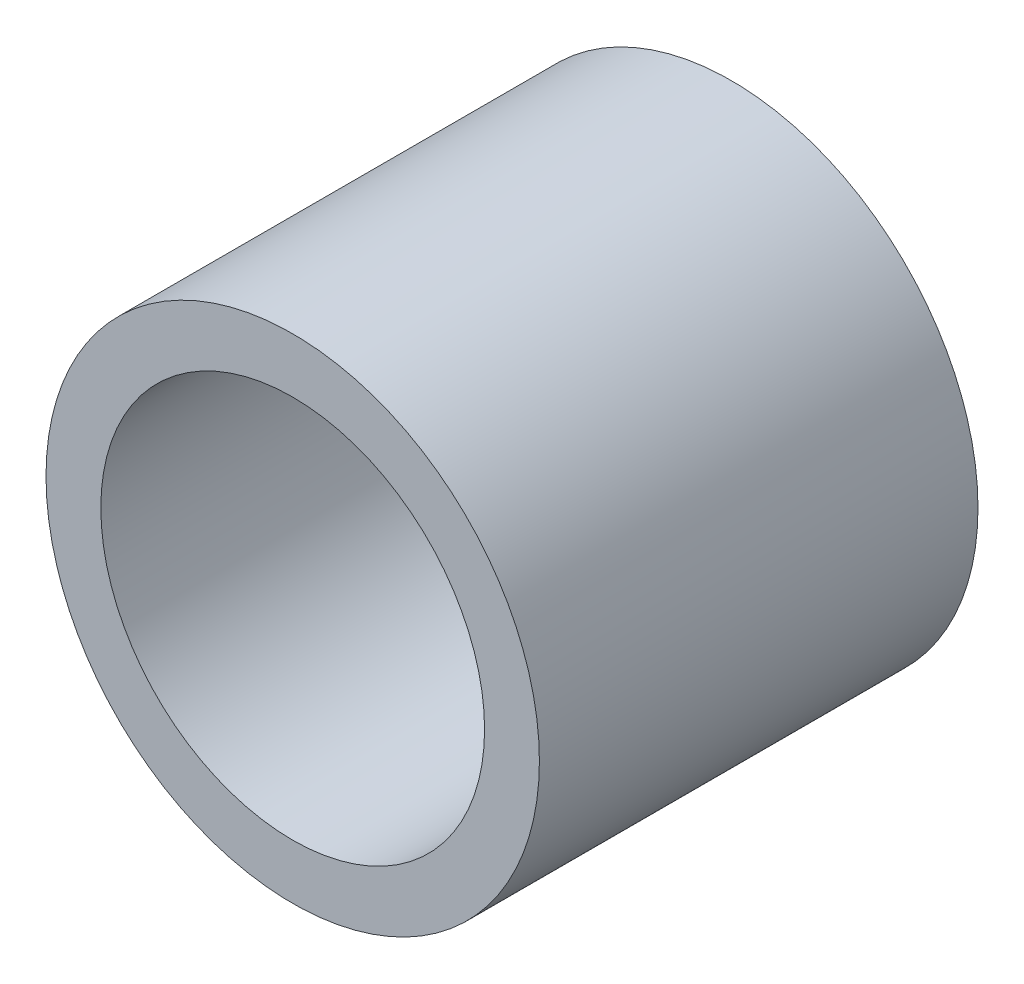
ISO-10303-21;
HEADER;
FILE_DESCRIPTION(('STEP AP214'),'2;1');
FILE_NAME('part.step','',(''),(''),'','','');
FILE_SCHEMA(('AUTOMOTIVE_DESIGN { 1 0 10303 214 1 1 1 1 }'));
ENDSEC;
DATA;
#1=APPLICATION_CONTEXT('core data for automotive mechanical design processes');
#2=APPLICATION_PROTOCOL_DEFINITION('international standard','automotive_design',2000,#1);
#3=PRODUCT_CONTEXT('',#1,'mechanical');
#4=PRODUCT('Part','Part','',(#3));
#5=PRODUCT_RELATED_PRODUCT_CATEGORY('part','',(#4));
#6=PRODUCT_DEFINITION_FORMATION('','',#4);
#7=PRODUCT_DEFINITION_CONTEXT('part definition',#1,'design');
#8=PRODUCT_DEFINITION('design','',#6,#7);
#9=PRODUCT_DEFINITION_SHAPE('','',#8);
#10=(LENGTH_UNIT() NAMED_UNIT(*) SI_UNIT(.MILLI.,.METRE.));
#11=(NAMED_UNIT(*) PLANE_ANGLE_UNIT() SI_UNIT($,.RADIAN.));
#12=(NAMED_UNIT(*) SI_UNIT($,.STERADIAN.) SOLID_ANGLE_UNIT());
#13=UNCERTAINTY_MEASURE_WITH_UNIT(LENGTH_MEASURE(1.E-05),#10,'distance_accuracy_value','');
#14=(GEOMETRIC_REPRESENTATION_CONTEXT(3) GLOBAL_UNCERTAINTY_ASSIGNED_CONTEXT((#13)) GLOBAL_UNIT_ASSIGNED_CONTEXT((#10,
#11,#12)) REPRESENTATION_CONTEXT('',''));
#15=CARTESIAN_POINT('',(0.,0.,0.));
#16=DIRECTION('',(0.,0.,1.));
#17=DIRECTION('',(1.,0.,0.));
#18=AXIS2_PLACEMENT_3D('',#15,#16,#17);
#19=CARTESIAN_POINT('',(0.,0.,50.8));
#20=DIRECTION('',(0.,0.,0.999999999999998));
#21=DIRECTION('',(1.00000000000001,0.,0.));
#22=AXIS2_PLACEMENT_3D('',#19,#20,#21);
#23=PLANE('',#22);
#24=CARTESIAN_POINT('',(0.,0.,50.8));
#25=DIRECTION('',(0.,0.,0.999999999999998));
#26=DIRECTION('',(1.00000000000001,0.,0.));
#27=AXIS2_PLACEMENT_3D('',#24,#25,#26);
#28=CIRCLE('',#27,28.575);
#29=CARTESIAN_POINT('',(-28.5750000000003,0.,50.8));
#30=VERTEX_POINT('',#29);
#31=EDGE_CURVE('E12',#30,#30,#28,.T.);
#32=ORIENTED_EDGE('',*,*,#31,.T.);
#33=EDGE_LOOP('',(#32));
#34=FACE_BOUND('',#33,.T.);
#35=CARTESIAN_POINT('',(0.,0.,50.8));
#36=DIRECTION('',(0.,0.,0.999999999999998));
#37=DIRECTION('',(1.00000000000001,0.,0.));
#38=AXIS2_PLACEMENT_3D('',#35,#36,#37);
#39=CIRCLE('',#38,22.225);
#40=CARTESIAN_POINT('',(-22.2250000000002,0.,50.8));
#41=VERTEX_POINT('',#40);
#42=EDGE_CURVE('E53',#41,#41,#39,.T.);
#43=ORIENTED_EDGE('',*,*,#42,.F.);
#44=EDGE_LOOP('',(#43));
#45=FACE_BOUND('',#44,.T.);
#46=ADVANCED_FACE('F42',(#34,#45),#23,.T.);
#47=CARTESIAN_POINT('',(0.,0.,0.));
#48=DIRECTION('',(0.,0.,0.999999999999998));
#49=DIRECTION('',(1.00000000000001,0.,0.));
#50=AXIS2_PLACEMENT_3D('',#47,#48,#49);
#51=PLANE('',#50);
#52=CARTESIAN_POINT('',(0.,0.,0.));
#53=DIRECTION('',(0.,0.,0.999999999999998));
#54=DIRECTION('',(1.00000000000001,0.,0.));
#55=AXIS2_PLACEMENT_3D('',#52,#53,#54);
#56=CIRCLE('',#55,28.575);
#57=CARTESIAN_POINT('',(-28.5750000000003,0.,0.));
#58=VERTEX_POINT('',#57);
#59=EDGE_CURVE('E46',#58,#58,#56,.T.);
#60=ORIENTED_EDGE('',*,*,#59,.F.);
#61=EDGE_LOOP('',(#60));
#62=FACE_BOUND('',#61,.T.);
#63=CARTESIAN_POINT('',(0.,0.,0.));
#64=DIRECTION('',(0.,0.,0.999999999999998));
#65=DIRECTION('',(1.00000000000001,0.,0.));
#66=AXIS2_PLACEMENT_3D('',#63,#64,#65);
#67=CIRCLE('',#66,22.225);
#68=CARTESIAN_POINT('',(-22.2250000000002,0.,0.));
#69=VERTEX_POINT('',#68);
#70=EDGE_CURVE('E55',#69,#69,#67,.T.);
#71=ORIENTED_EDGE('',*,*,#70,.T.);
#72=EDGE_LOOP('',(#71));
#73=FACE_BOUND('',#72,.T.);
#74=ADVANCED_FACE('F65',(#62,#73),#51,.F.);
#75=CARTESIAN_POINT('',(0.,0.,50.8));
#76=DIRECTION('',(0.,0.,-0.999999999999998));
#77=DIRECTION('',(-1.00000000000001,0.,0.));
#78=AXIS2_PLACEMENT_3D('',#75,#76,#77);
#79=CYLINDRICAL_SURFACE('',#78,28.575);
#80=CARTESIAN_POINT('',(-28.5750000000003,0.,50.8));
#81=CARTESIAN_POINT('',(-28.5750000000003,0.,50.2708333333333));
#82=CARTESIAN_POINT('',(-28.5750000000003,0.,49.7416666666667));
#83=CARTESIAN_POINT('',(-28.5750000000003,0.,48.6833333333333));
#84=CARTESIAN_POINT('',(-28.5750000000003,0.,48.1541666666666));
#85=CARTESIAN_POINT('',(-28.5750000000003,0.,47.0958333333333));
#86=CARTESIAN_POINT('',(-28.5750000000003,0.,46.5666666666666));
#87=CARTESIAN_POINT('',(-28.5750000000003,0.,45.5083333333333));
#88=CARTESIAN_POINT('',(-28.5750000000003,0.,44.9791666666667));
#89=CARTESIAN_POINT('',(-28.5750000000003,0.,43.9208333333333));
#90=CARTESIAN_POINT('',(-28.5750000000003,0.,43.3916666666667));
#91=CARTESIAN_POINT('',(-28.5750000000003,0.,42.3333333333333));
#92=CARTESIAN_POINT('',(-28.5750000000003,0.,41.8041666666667));
#93=CARTESIAN_POINT('',(-28.5750000000003,0.,40.7458333333333));
#94=CARTESIAN_POINT('',(-28.5750000000003,0.,40.2166666666667));
#95=CARTESIAN_POINT('',(-28.5750000000003,0.,39.1583333333333));
#96=CARTESIAN_POINT('',(-28.5750000000003,0.,38.6291666666666));
#97=CARTESIAN_POINT('',(-28.5750000000003,0.,37.5708333333333));
#98=CARTESIAN_POINT('',(-28.5750000000003,0.,37.0416666666667));
#99=CARTESIAN_POINT('',(-28.5750000000003,0.,35.9833333333333));
#100=CARTESIAN_POINT('',(-28.5750000000003,0.,35.4541666666667));
#101=CARTESIAN_POINT('',(-28.5750000000003,0.,34.3958333333333));
#102=CARTESIAN_POINT('',(-28.5750000000003,0.,33.8666666666667));
#103=CARTESIAN_POINT('',(-28.5750000000003,0.,32.8083333333333));
#104=CARTESIAN_POINT('',(-28.5750000000003,0.,32.2791666666667));
#105=CARTESIAN_POINT('',(-28.5750000000003,0.,31.2208333333333));
#106=CARTESIAN_POINT('',(-28.5750000000003,0.,30.6916666666667));
#107=CARTESIAN_POINT('',(-28.5750000000003,0.,29.6333333333333));
#108=CARTESIAN_POINT('',(-28.5750000000003,0.,29.1041666666667));
#109=CARTESIAN_POINT('',(-28.5750000000003,0.,28.0458333333333));
#110=CARTESIAN_POINT('',(-28.5750000000003,0.,27.5166666666667));
#111=CARTESIAN_POINT('',(-28.5750000000003,0.,26.4583333333333));
#112=CARTESIAN_POINT('',(-28.5750000000003,0.,25.9291666666667));
#113=CARTESIAN_POINT('',(-28.5750000000003,0.,24.8708333333333));
#114=CARTESIAN_POINT('',(-28.5750000000003,0.,24.3416666666667));
#115=CARTESIAN_POINT('',(-28.5750000000003,0.,23.2833333333333));
#116=CARTESIAN_POINT('',(-28.5750000000003,0.,22.7541666666667));
#117=CARTESIAN_POINT('',(-28.5750000000003,0.,21.6958333333333));
#118=CARTESIAN_POINT('',(-28.5750000000003,0.,21.1666666666667));
#119=CARTESIAN_POINT('',(-28.5750000000003,0.,20.1083333333333));
#120=CARTESIAN_POINT('',(-28.5750000000003,0.,19.5791666666667));
#121=CARTESIAN_POINT('',(-28.5750000000003,0.,18.5208333333333));
#122=CARTESIAN_POINT('',(-28.5750000000003,0.,17.9916666666667));
#123=CARTESIAN_POINT('',(-28.5750000000003,0.,16.9333333333333));
#124=CARTESIAN_POINT('',(-28.5750000000003,0.,16.4041666666667));
#125=CARTESIAN_POINT('',(-28.5750000000003,0.,15.3458333333333));
#126=CARTESIAN_POINT('',(-28.5750000000003,0.,14.8166666666667));
#127=CARTESIAN_POINT('',(-28.5750000000003,0.,13.7583333333333));
#128=CARTESIAN_POINT('',(-28.5750000000003,0.,13.2291666666667));
#129=CARTESIAN_POINT('',(-28.5750000000003,0.,12.1708333333333));
#130=CARTESIAN_POINT('',(-28.5750000000003,0.,11.6416666666667));
#131=CARTESIAN_POINT('',(-28.5750000000003,0.,10.5833333333333));
#132=CARTESIAN_POINT('',(-28.5750000000003,0.,10.0541666666667));
#133=CARTESIAN_POINT('',(-28.5750000000003,0.,8.99583333333333));
#134=CARTESIAN_POINT('',(-28.5750000000003,0.,8.46666666666667));
#135=CARTESIAN_POINT('',(-28.5750000000003,0.,7.40833333333333));
#136=CARTESIAN_POINT('',(-28.5750000000003,0.,6.87916666666667));
#137=CARTESIAN_POINT('',(-28.5750000000003,0.,5.82083333333333));
#138=CARTESIAN_POINT('',(-28.5750000000003,0.,5.29166666666666));
#139=CARTESIAN_POINT('',(-28.5750000000003,0.,4.23333333333333));
#140=CARTESIAN_POINT('',(-28.5750000000003,0.,3.70416666666666));
#141=CARTESIAN_POINT('',(-28.5750000000003,0.,2.64583333333333));
#142=CARTESIAN_POINT('',(-28.5750000000003,0.,2.11666666666666));
#143=CARTESIAN_POINT('',(-28.5750000000003,0.,1.05833333333333));
#144=CARTESIAN_POINT('',(-28.5750000000003,0.,0.529166666666666));
#145=CARTESIAN_POINT('',(-28.5750000000003,0.,0.));
#146=B_SPLINE_CURVE_WITH_KNOTS('',3,(#80,#81,#82,#83,#84,#85,#86,#87,#88,#89,#90,#91,#92,#93,
#94,#95,#96,#97,#98,#99,#100,#101,#102,#103,#104,#105,#106,#107,#108,#109,#110,#111,#112,#113,
#114,#115,#116,#117,#118,#119,#120,#121,#122,#123,#124,#125,#126,#127,#128,#129,#130,#131,#132,
#133,#134,#135,#136,#137,#138,#139,#140,#141,#142,#143,#144,#145),.UNSPECIFIED.,.F.,.F.,(4,2,2,
2,2,2,2,2,2,2,2,2,2,2,2,2,2,2,2,2,2,2,2,2,2,2,2,2,2,2,2,2,4),(0.,1.58750000000001,3.175,4.7625,
6.35,7.9375,9.525,11.1125,12.7,14.2875,15.875,17.4625,19.05,20.6375,22.225,23.8125,25.4,26.9875,
28.575,30.1625,31.75,33.3375,34.925,36.5125,38.1,39.6875,41.275,42.8625,44.45,46.0375,47.625,
49.2125,50.8),.UNSPECIFIED.);
#147=EDGE_CURVE('BSEAM44',#30,#58,#146,.T.);
#148=ORIENTED_EDGE('',*,*,#31,.F.);
#149=ORIENTED_EDGE('',*,*,#59,.T.);
#150=ORIENTED_EDGE('',*,*,#147,.T.);
#151=ORIENTED_EDGE('',*,*,#147,.F.);
#152=EDGE_LOOP('',(#148,#150,#149,#151));
#153=FACE_BOUND('',#152,.T.);
#154=ADVANCED_FACE('F44',(#153),#79,.T.);
#155=CARTESIAN_POINT('',(0.,0.,50.8));
#156=DIRECTION('',(0.,0.,-0.999999999999998));
#157=DIRECTION('',(-1.00000000000001,0.,0.));
#158=AXIS2_PLACEMENT_3D('',#155,#156,#157);
#159=CYLINDRICAL_SURFACE('',#158,22.225);
#160=CARTESIAN_POINT('',(-22.2250000000002,0.,50.8));
#161=CARTESIAN_POINT('',(-22.2250000000002,0.,50.2708333333333));
#162=CARTESIAN_POINT('',(-22.2250000000002,0.,49.7416666666667));
#163=CARTESIAN_POINT('',(-22.2250000000002,0.,48.6833333333333));
#164=CARTESIAN_POINT('',(-22.2250000000002,0.,48.1541666666666));
#165=CARTESIAN_POINT('',(-22.2250000000002,0.,47.0958333333333));
#166=CARTESIAN_POINT('',(-22.2250000000002,0.,46.5666666666666));
#167=CARTESIAN_POINT('',(-22.2250000000002,0.,45.5083333333333));
#168=CARTESIAN_POINT('',(-22.2250000000002,0.,44.9791666666667));
#169=CARTESIAN_POINT('',(-22.2250000000002,0.,43.9208333333333));
#170=CARTESIAN_POINT('',(-22.2250000000002,0.,43.3916666666667));
#171=CARTESIAN_POINT('',(-22.2250000000002,0.,42.3333333333333));
#172=CARTESIAN_POINT('',(-22.2250000000002,0.,41.8041666666667));
#173=CARTESIAN_POINT('',(-22.2250000000002,0.,40.7458333333333));
#174=CARTESIAN_POINT('',(-22.2250000000002,0.,40.2166666666667));
#175=CARTESIAN_POINT('',(-22.2250000000002,0.,39.1583333333333));
#176=CARTESIAN_POINT('',(-22.2250000000002,0.,38.6291666666666));
#177=CARTESIAN_POINT('',(-22.2250000000002,0.,37.5708333333333));
#178=CARTESIAN_POINT('',(-22.2250000000002,0.,37.0416666666667));
#179=CARTESIAN_POINT('',(-22.2250000000002,0.,35.9833333333333));
#180=CARTESIAN_POINT('',(-22.2250000000002,0.,35.4541666666667));
#181=CARTESIAN_POINT('',(-22.2250000000002,0.,34.3958333333333));
#182=CARTESIAN_POINT('',(-22.2250000000002,0.,33.8666666666667));
#183=CARTESIAN_POINT('',(-22.2250000000002,0.,32.8083333333333));
#184=CARTESIAN_POINT('',(-22.2250000000002,0.,32.2791666666667));
#185=CARTESIAN_POINT('',(-22.2250000000002,0.,31.2208333333333));
#186=CARTESIAN_POINT('',(-22.2250000000002,0.,30.6916666666667));
#187=CARTESIAN_POINT('',(-22.2250000000002,0.,29.6333333333333));
#188=CARTESIAN_POINT('',(-22.2250000000002,0.,29.1041666666667));
#189=CARTESIAN_POINT('',(-22.2250000000002,0.,28.0458333333333));
#190=CARTESIAN_POINT('',(-22.2250000000002,0.,27.5166666666667));
#191=CARTESIAN_POINT('',(-22.2250000000002,0.,26.4583333333333));
#192=CARTESIAN_POINT('',(-22.2250000000002,0.,25.9291666666667));
#193=CARTESIAN_POINT('',(-22.2250000000002,0.,24.8708333333333));
#194=CARTESIAN_POINT('',(-22.2250000000002,0.,24.3416666666667));
#195=CARTESIAN_POINT('',(-22.2250000000002,0.,23.2833333333333));
#196=CARTESIAN_POINT('',(-22.2250000000002,0.,22.7541666666667));
#197=CARTESIAN_POINT('',(-22.2250000000002,0.,21.6958333333333));
#198=CARTESIAN_POINT('',(-22.2250000000002,0.,21.1666666666667));
#199=CARTESIAN_POINT('',(-22.2250000000002,0.,20.1083333333333));
#200=CARTESIAN_POINT('',(-22.2250000000002,0.,19.5791666666667));
#201=CARTESIAN_POINT('',(-22.2250000000002,0.,18.5208333333333));
#202=CARTESIAN_POINT('',(-22.2250000000002,0.,17.9916666666667));
#203=CARTESIAN_POINT('',(-22.2250000000002,0.,16.9333333333333));
#204=CARTESIAN_POINT('',(-22.2250000000002,0.,16.4041666666667));
#205=CARTESIAN_POINT('',(-22.2250000000002,0.,15.3458333333333));
#206=CARTESIAN_POINT('',(-22.2250000000002,0.,14.8166666666667));
#207=CARTESIAN_POINT('',(-22.2250000000002,0.,13.7583333333333));
#208=CARTESIAN_POINT('',(-22.2250000000002,0.,13.2291666666667));
#209=CARTESIAN_POINT('',(-22.2250000000002,0.,12.1708333333333));
#210=CARTESIAN_POINT('',(-22.2250000000002,0.,11.6416666666667));
#211=CARTESIAN_POINT('',(-22.2250000000002,0.,10.5833333333333));
#212=CARTESIAN_POINT('',(-22.2250000000002,0.,10.0541666666667));
#213=CARTESIAN_POINT('',(-22.2250000000002,0.,8.99583333333333));
#214=CARTESIAN_POINT('',(-22.2250000000002,0.,8.46666666666667));
#215=CARTESIAN_POINT('',(-22.2250000000002,0.,7.40833333333333));
#216=CARTESIAN_POINT('',(-22.2250000000002,0.,6.87916666666667));
#217=CARTESIAN_POINT('',(-22.2250000000002,0.,5.82083333333333));
#218=CARTESIAN_POINT('',(-22.2250000000002,0.,5.29166666666666));
#219=CARTESIAN_POINT('',(-22.2250000000002,0.,4.23333333333333));
#220=CARTESIAN_POINT('',(-22.2250000000002,0.,3.70416666666666));
#221=CARTESIAN_POINT('',(-22.2250000000002,0.,2.64583333333333));
#222=CARTESIAN_POINT('',(-22.2250000000002,0.,2.11666666666666));
#223=CARTESIAN_POINT('',(-22.2250000000002,0.,1.05833333333333));
#224=CARTESIAN_POINT('',(-22.2250000000002,0.,0.529166666666666));
#225=CARTESIAN_POINT('',(-22.2250000000002,0.,0.));
#226=B_SPLINE_CURVE_WITH_KNOTS('',3,(#160,#161,#162,#163,#164,#165,#166,#167,#168,#169,#170,
#171,#172,#173,#174,#175,#176,#177,#178,#179,#180,#181,#182,#183,#184,#185,#186,#187,#188,#189,
#190,#191,#192,#193,#194,#195,#196,#197,#198,#199,#200,#201,#202,#203,#204,#205,#206,#207,#208,
#209,#210,#211,#212,#213,#214,#215,#216,#217,#218,#219,#220,#221,#222,#223,#224,#225),
.UNSPECIFIED.,.F.,.F.,(4,2,2,2,2,2,2,2,2,2,2,2,2,2,2,2,2,2,2,2,2,2,2,2,2,2,2,2,2,2,2,2,4),(0.,
1.58750000000001,3.175,4.7625,6.35,7.9375,9.525,11.1125,12.7,14.2875,15.875,17.4625,19.05,
20.6375,22.225,23.8125,25.4,26.9875,28.575,30.1625,31.75,33.3375,34.925,36.5125,38.1,39.6875,
41.275,42.8625,44.45,46.0375,47.625,49.2125,50.8),.UNSPECIFIED.);
#227=EDGE_CURVE('BSEAM61',#41,#69,#226,.T.);
#228=ORIENTED_EDGE('',*,*,#42,.T.);
#229=ORIENTED_EDGE('',*,*,#70,.F.);
#230=ORIENTED_EDGE('',*,*,#227,.T.);
#231=ORIENTED_EDGE('',*,*,#227,.F.);
#232=EDGE_LOOP('',(#228,#230,#229,#231));
#233=FACE_BOUND('',#232,.T.);
#234=ADVANCED_FACE('F61',(#233),#159,.F.);
#235=CLOSED_SHELL('',(#46,#74,#154,#234));
#236=MANIFOLD_SOLID_BREP('B2',#235);
#237=ADVANCED_BREP_SHAPE_REPRESENTATION('',(#18,#236),#14);
#238=SHAPE_DEFINITION_REPRESENTATION(#9,#237);
ENDSEC;
END-ISO-10303-21;
